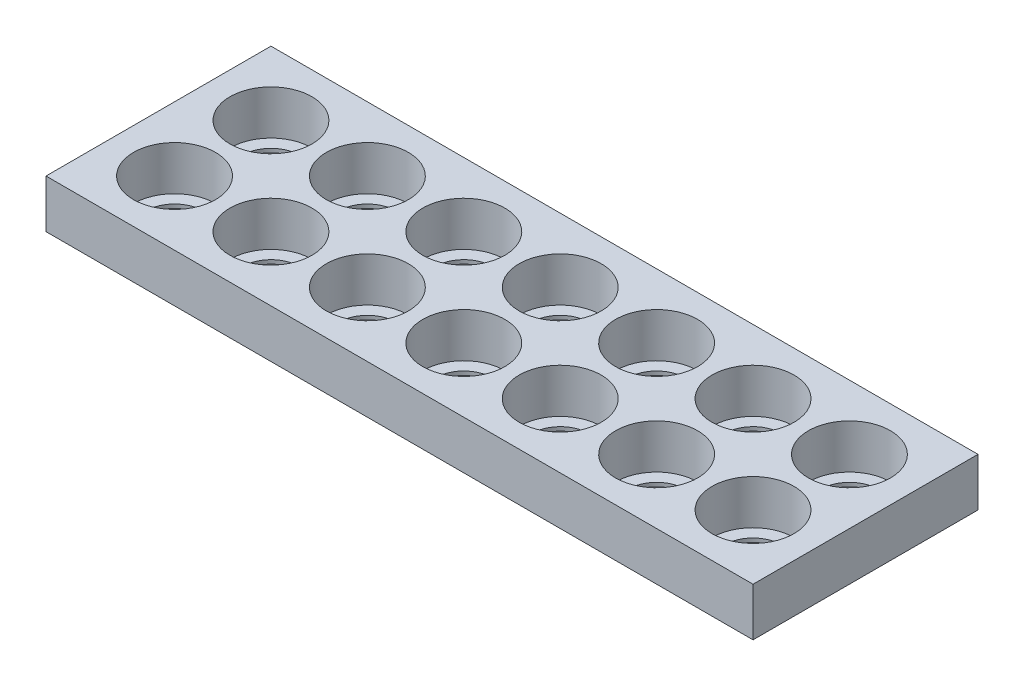
ISO-10303-21;
HEADER;
FILE_DESCRIPTION(('STEP AP214'),'2;1');
FILE_NAME('part.step','',(''),(''),'','','');
FILE_SCHEMA(('AUTOMOTIVE_DESIGN { 1 0 10303 214 1 1 1 1 }'));
ENDSEC;
DATA;
#1=APPLICATION_CONTEXT('core data for automotive mechanical design processes');
#2=APPLICATION_PROTOCOL_DEFINITION('international standard','automotive_design',2000,#1);
#3=PRODUCT_CONTEXT('',#1,'mechanical');
#4=PRODUCT('Part','Part','',(#3));
#5=PRODUCT_RELATED_PRODUCT_CATEGORY('part','',(#4));
#6=PRODUCT_DEFINITION_FORMATION('','',#4);
#7=PRODUCT_DEFINITION_CONTEXT('part definition',#1,'design');
#8=PRODUCT_DEFINITION('design','',#6,#7);
#9=PRODUCT_DEFINITION_SHAPE('','',#8);
#10=(LENGTH_UNIT() NAMED_UNIT(*) SI_UNIT(.MILLI.,.METRE.));
#11=(NAMED_UNIT(*) PLANE_ANGLE_UNIT() SI_UNIT($,.RADIAN.));
#12=(NAMED_UNIT(*) SI_UNIT($,.STERADIAN.) SOLID_ANGLE_UNIT());
#13=UNCERTAINTY_MEASURE_WITH_UNIT(LENGTH_MEASURE(1.E-05),#10,'distance_accuracy_value','');
#14=(GEOMETRIC_REPRESENTATION_CONTEXT(3) GLOBAL_UNCERTAINTY_ASSIGNED_CONTEXT((#13)) GLOBAL_UNIT_ASSIGNED_CONTEXT((#10,
#11,#12)) REPRESENTATION_CONTEXT('',''));
#15=CARTESIAN_POINT('',(0.,0.,0.));
#16=DIRECTION('',(0.,0.,1.));
#17=DIRECTION('',(1.,0.,0.));
#18=AXIS2_PLACEMENT_3D('',#15,#16,#17);
#19=CARTESIAN_POINT('',(0.,12.7,16.9333333333333));
#20=DIRECTION('',(0.,0.,-1.));
#21=DIRECTION('',(-1.,0.,0.));
#22=AXIS2_PLACEMENT_3D('',#19,#20,#21);
#23=PLANE('',#22);
#24=DIRECTION('',(1.,0.,0.));
#25=VECTOR('',#24,1.);
#26=CARTESIAN_POINT('',(0.,0.,16.9333333333333));
#27=LINE('',#26,#25);
#28=CARTESIAN_POINT('',(-16.9333333333333,0.,16.9333333333333));
#29=VERTEX_POINT('',#28);
#30=CARTESIAN_POINT('',(169.333333333333,0.,16.9333333333333));
#31=VERTEX_POINT('',#30);
#32=EDGE_CURVE('E120',#29,#31,#27,.T.);
#33=ORIENTED_EDGE('',*,*,#32,.T.);
#34=DIRECTION('',(0.,-1.,0.));
#35=VECTOR('',#34,1.);
#36=CARTESIAN_POINT('',(169.333333333333,12.7,16.9333333333333));
#37=LINE('',#36,#35);
#38=CARTESIAN_POINT('',(169.333333333333,12.7,16.9333333333333));
#39=VERTEX_POINT('',#38);
#40=EDGE_CURVE('E110',#39,#31,#37,.T.);
#41=ORIENTED_EDGE('',*,*,#40,.F.);
#42=DIRECTION('',(1.,0.,0.));
#43=VECTOR('',#42,1.);
#44=CARTESIAN_POINT('',(0.,12.7,16.9333333333333));
#45=LINE('',#44,#43);
#46=CARTESIAN_POINT('',(-16.9333333333333,12.7,16.9333333333333));
#47=VERTEX_POINT('',#46);
#48=EDGE_CURVE('E99',#47,#39,#45,.T.);
#49=ORIENTED_EDGE('',*,*,#48,.F.);
#50=DIRECTION('',(0.,-1.,0.));
#51=VECTOR('',#50,1.);
#52=CARTESIAN_POINT('',(-16.9333333333333,12.7,16.9333333333333));
#53=LINE('',#52,#51);
#54=EDGE_CURVE('E65',#47,#29,#53,.T.);
#55=ORIENTED_EDGE('',*,*,#54,.T.);
#56=EDGE_LOOP('',(#33,#41,#49,#55));
#57=FACE_BOUND('',#56,.T.);
#58=ADVANCED_FACE('F47',(#57),#23,.F.);
#59=CARTESIAN_POINT('',(169.333333333333,12.7,0.));
#60=DIRECTION('',(-1.,0.,0.));
#61=DIRECTION('',(0.,0.,1.));
#62=AXIS2_PLACEMENT_3D('',#59,#60,#61);
#63=PLANE('',#62);
#64=DIRECTION('',(0.,0.,-1.));
#65=VECTOR('',#64,1.);
#66=CARTESIAN_POINT('',(169.333333333333,0.,0.));
#67=LINE('',#66,#65);
#68=CARTESIAN_POINT('',(169.333333333333,0.,-42.3333333333333));
#69=VERTEX_POINT('',#68);
#70=EDGE_CURVE('E106',#31,#69,#67,.T.);
#71=ORIENTED_EDGE('',*,*,#70,.T.);
#72=DIRECTION('',(0.,-1.,0.));
#73=VECTOR('',#72,1.);
#74=CARTESIAN_POINT('',(169.333333333333,12.7,-42.3333333333333));
#75=LINE('',#74,#73);
#76=CARTESIAN_POINT('',(169.333333333333,12.7,-42.3333333333333));
#77=VERTEX_POINT('',#76);
#78=EDGE_CURVE('E104',#77,#69,#75,.T.);
#79=ORIENTED_EDGE('',*,*,#78,.F.);
#80=DIRECTION('',(0.,0.,-1.));
#81=VECTOR('',#80,1.);
#82=CARTESIAN_POINT('',(169.333333333333,12.7,0.));
#83=LINE('',#82,#81);
#84=EDGE_CURVE('E91',#39,#77,#83,.T.);
#85=ORIENTED_EDGE('',*,*,#84,.F.);
#86=ORIENTED_EDGE('',*,*,#40,.T.);
#87=EDGE_LOOP('',(#71,#79,#85,#86));
#88=FACE_BOUND('',#87,.T.);
#89=ADVANCED_FACE('F105',(#88),#63,.F.);
#90=CARTESIAN_POINT('',(0.,12.7,-42.3333333333333));
#91=DIRECTION('',(0.,0.,-1.));
#92=DIRECTION('',(-1.,0.,0.));
#93=AXIS2_PLACEMENT_3D('',#90,#91,#92);
#94=PLANE('',#93);
#95=DIRECTION('',(1.,0.,0.));
#96=VECTOR('',#95,1.);
#97=CARTESIAN_POINT('',(0.,0.,-42.3333333333333));
#98=LINE('',#97,#96);
#99=CARTESIAN_POINT('',(-16.9333333333333,0.,-42.3333333333333));
#100=VERTEX_POINT('',#99);
#101=EDGE_CURVE('E126',#100,#69,#98,.T.);
#102=ORIENTED_EDGE('',*,*,#101,.F.);
#103=DIRECTION('',(0.,-1.,0.));
#104=VECTOR('',#103,1.);
#105=CARTESIAN_POINT('',(-16.9333333333333,12.7,-42.3333333333333));
#106=LINE('',#105,#104);
#107=CARTESIAN_POINT('',(-16.9333333333333,12.7,-42.3333333333333));
#108=VERTEX_POINT('',#107);
#109=EDGE_CURVE('E79',#108,#100,#106,.T.);
#110=ORIENTED_EDGE('',*,*,#109,.F.);
#111=DIRECTION('',(1.,0.,0.));
#112=VECTOR('',#111,1.);
#113=CARTESIAN_POINT('',(0.,12.7,-42.3333333333333));
#114=LINE('',#113,#112);
#115=EDGE_CURVE('E98',#108,#77,#114,.T.);
#116=ORIENTED_EDGE('',*,*,#115,.T.);
#117=ORIENTED_EDGE('',*,*,#78,.T.);
#118=EDGE_LOOP('',(#102,#110,#116,#117));
#119=FACE_BOUND('',#118,.T.);
#120=ADVANCED_FACE('F112',(#119),#94,.T.);
#121=CARTESIAN_POINT('',(0.,12.7,0.));
#122=DIRECTION('',(0.,-1.,0.));
#123=DIRECTION('',(0.,0.,-1.));
#124=AXIS2_PLACEMENT_3D('',#121,#122,#123);
#125=CYLINDRICAL_SURFACE('',#124,10.8);
#126=CARTESIAN_POINT('',(0.,1.016,0.));
#127=DIRECTION('',(0.,1.,0.));
#128=DIRECTION('',(0.,0.,1.));
#129=AXIS2_PLACEMENT_3D('',#126,#127,#128);
#130=CIRCLE('',#129,10.8);
#131=CARTESIAN_POINT('',(0.,1.016,10.8));
#132=VERTEX_POINT('',#131);
#133=EDGE_CURVE('E168',#132,#132,#130,.T.);
#134=ORIENTED_EDGE('',*,*,#133,.F.);
#135=EDGE_LOOP('',(#134));
#136=FACE_BOUND('',#135,.T.);
#137=CARTESIAN_POINT('',(0.,12.7,0.));
#138=DIRECTION('',(0.,1.,0.));
#139=DIRECTION('',(0.,0.,1.));
#140=AXIS2_PLACEMENT_3D('',#137,#138,#139);
#141=CIRCLE('',#140,10.8);
#142=CARTESIAN_POINT('',(0.,12.7,10.8));
#143=VERTEX_POINT('',#142);
#144=EDGE_CURVE('E228',#143,#143,#141,.T.);
#145=ORIENTED_EDGE('',*,*,#144,.T.);
#146=EDGE_LOOP('',(#145));
#147=FACE_BOUND('',#146,.T.);
#148=ADVANCED_FACE('F234',(#136,#147),#125,.F.);
#149=CARTESIAN_POINT('',(25.4,12.7,0.));
#150=DIRECTION('',(0.,-1.,0.));
#151=DIRECTION('',(0.,0.,-1.));
#152=AXIS2_PLACEMENT_3D('',#149,#150,#151);
#153=CYLINDRICAL_SURFACE('',#152,10.8);
#154=CARTESIAN_POINT('',(25.4,1.016,0.));
#155=DIRECTION('',(0.,1.,0.));
#156=DIRECTION('',(0.,0.,1.));
#157=AXIS2_PLACEMENT_3D('',#154,#155,#156);
#158=CIRCLE('',#157,10.8);
#159=CARTESIAN_POINT('',(25.4,1.016,10.8));
#160=VERTEX_POINT('',#159);
#161=EDGE_CURVE('E172',#160,#160,#158,.T.);
#162=ORIENTED_EDGE('',*,*,#161,.F.);
#163=EDGE_LOOP('',(#162));
#164=FACE_BOUND('',#163,.T.);
#165=CARTESIAN_POINT('',(25.4,12.7,0.));
#166=DIRECTION('',(0.,1.,0.));
#167=DIRECTION('',(0.,0.,1.));
#168=AXIS2_PLACEMENT_3D('',#165,#166,#167);
#169=CIRCLE('',#168,10.8);
#170=CARTESIAN_POINT('',(25.4,12.7,10.8));
#171=VERTEX_POINT('',#170);
#172=EDGE_CURVE('E224',#171,#171,#169,.T.);
#173=ORIENTED_EDGE('',*,*,#172,.T.);
#174=EDGE_LOOP('',(#173));
#175=FACE_BOUND('',#174,.T.);
#176=ADVANCED_FACE('F262',(#164,#175),#153,.F.);
#177=CARTESIAN_POINT('',(50.8,12.7,0.));
#178=DIRECTION('',(0.,-1.,0.));
#179=DIRECTION('',(0.,0.,-1.));
#180=AXIS2_PLACEMENT_3D('',#177,#178,#179);
#181=CYLINDRICAL_SURFACE('',#180,10.8);
#182=CARTESIAN_POINT('',(50.8,1.016,0.));
#183=DIRECTION('',(0.,1.,0.));
#184=DIRECTION('',(0.,0.,1.));
#185=AXIS2_PLACEMENT_3D('',#182,#183,#184);
#186=CIRCLE('',#185,10.8);
#187=CARTESIAN_POINT('',(50.8,1.016,10.8));
#188=VERTEX_POINT('',#187);
#189=EDGE_CURVE('E176',#188,#188,#186,.T.);
#190=ORIENTED_EDGE('',*,*,#189,.F.);
#191=EDGE_LOOP('',(#190));
#192=FACE_BOUND('',#191,.T.);
#193=CARTESIAN_POINT('',(50.8,12.7,0.));
#194=DIRECTION('',(0.,1.,0.));
#195=DIRECTION('',(0.,0.,1.));
#196=AXIS2_PLACEMENT_3D('',#193,#194,#195);
#197=CIRCLE('',#196,10.8);
#198=CARTESIAN_POINT('',(50.8,12.7,10.8));
#199=VERTEX_POINT('',#198);
#200=EDGE_CURVE('E220',#199,#199,#197,.T.);
#201=ORIENTED_EDGE('',*,*,#200,.T.);
#202=EDGE_LOOP('',(#201));
#203=FACE_BOUND('',#202,.T.);
#204=ADVANCED_FACE('F266',(#192,#203),#181,.F.);
#205=CARTESIAN_POINT('',(76.2,12.7,0.));
#206=DIRECTION('',(0.,-1.,0.));
#207=DIRECTION('',(0.,0.,-1.));
#208=AXIS2_PLACEMENT_3D('',#205,#206,#207);
#209=CYLINDRICAL_SURFACE('',#208,10.8);
#210=CARTESIAN_POINT('',(76.2,1.016,0.));
#211=DIRECTION('',(0.,1.,0.));
#212=DIRECTION('',(0.,0.,1.));
#213=AXIS2_PLACEMENT_3D('',#210,#211,#212);
#214=CIRCLE('',#213,10.8);
#215=CARTESIAN_POINT('',(76.2,1.016,10.8));
#216=VERTEX_POINT('',#215);
#217=EDGE_CURVE('E180',#216,#216,#214,.T.);
#218=ORIENTED_EDGE('',*,*,#217,.F.);
#219=EDGE_LOOP('',(#218));
#220=FACE_BOUND('',#219,.T.);
#221=CARTESIAN_POINT('',(76.2,12.7,0.));
#222=DIRECTION('',(0.,1.,0.));
#223=DIRECTION('',(0.,0.,1.));
#224=AXIS2_PLACEMENT_3D('',#221,#222,#223);
#225=CIRCLE('',#224,10.8);
#226=CARTESIAN_POINT('',(76.2,12.7,10.8));
#227=VERTEX_POINT('',#226);
#228=EDGE_CURVE('E210',#227,#227,#225,.T.);
#229=ORIENTED_EDGE('',*,*,#228,.T.);
#230=EDGE_LOOP('',(#229));
#231=FACE_BOUND('',#230,.T.);
#232=ADVANCED_FACE('F270',(#220,#231),#209,.F.);
#233=CARTESIAN_POINT('',(101.6,12.7,0.));
#234=DIRECTION('',(0.,-1.,0.));
#235=DIRECTION('',(0.,0.,-1.));
#236=AXIS2_PLACEMENT_3D('',#233,#234,#235);
#237=CYLINDRICAL_SURFACE('',#236,10.8);
#238=CARTESIAN_POINT('',(101.6,1.016,0.));
#239=DIRECTION('',(0.,1.,0.));
#240=DIRECTION('',(0.,0.,1.));
#241=AXIS2_PLACEMENT_3D('',#238,#239,#240);
#242=CIRCLE('',#241,10.8);
#243=CARTESIAN_POINT('',(101.6,1.016,10.8));
#244=VERTEX_POINT('',#243);
#245=EDGE_CURVE('E184',#244,#244,#242,.T.);
#246=ORIENTED_EDGE('',*,*,#245,.F.);
#247=EDGE_LOOP('',(#246));
#248=FACE_BOUND('',#247,.T.);
#249=CARTESIAN_POINT('',(101.6,12.7,0.));
#250=DIRECTION('',(0.,1.,0.));
#251=DIRECTION('',(0.,0.,1.));
#252=AXIS2_PLACEMENT_3D('',#249,#250,#251);
#253=CIRCLE('',#252,10.8);
#254=CARTESIAN_POINT('',(101.6,12.7,10.8));
#255=VERTEX_POINT('',#254);
#256=EDGE_CURVE('E204',#255,#255,#253,.T.);
#257=ORIENTED_EDGE('',*,*,#256,.T.);
#258=EDGE_LOOP('',(#257));
#259=FACE_BOUND('',#258,.T.);
#260=ADVANCED_FACE('F197',(#248,#259),#237,.F.);
#261=CARTESIAN_POINT('',(127.,12.7,0.));
#262=DIRECTION('',(0.,-1.,0.));
#263=DIRECTION('',(0.,0.,-1.));
#264=AXIS2_PLACEMENT_3D('',#261,#262,#263);
#265=CYLINDRICAL_SURFACE('',#264,10.8);
#266=CARTESIAN_POINT('',(127.,1.016,0.));
#267=DIRECTION('',(0.,1.,0.));
#268=DIRECTION('',(0.,0.,1.));
#269=AXIS2_PLACEMENT_3D('',#266,#267,#268);
#270=CIRCLE('',#269,10.8);
#271=CARTESIAN_POINT('',(127.,1.016,10.8));
#272=VERTEX_POINT('',#271);
#273=EDGE_CURVE('E57',#272,#272,#270,.T.);
#274=ORIENTED_EDGE('',*,*,#273,.F.);
#275=EDGE_LOOP('',(#274));
#276=FACE_BOUND('',#275,.T.);
#277=CARTESIAN_POINT('',(127.,12.7,0.));
#278=DIRECTION('',(0.,1.,0.));
#279=DIRECTION('',(0.,0.,1.));
#280=AXIS2_PLACEMENT_3D('',#277,#278,#279);
#281=CIRCLE('',#280,10.8);
#282=CARTESIAN_POINT('',(127.,12.7,10.8));
#283=VERTEX_POINT('',#282);
#284=EDGE_CURVE('E201',#283,#283,#281,.T.);
#285=ORIENTED_EDGE('',*,*,#284,.T.);
#286=EDGE_LOOP('',(#285));
#287=FACE_BOUND('',#286,.T.);
#288=ADVANCED_FACE('F193',(#276,#287),#265,.F.);
#289=CARTESIAN_POINT('',(152.4,12.7,0.));
#290=DIRECTION('',(0.,-1.,0.));
#291=DIRECTION('',(0.,0.,-1.));
#292=AXIS2_PLACEMENT_3D('',#289,#290,#291);
#293=CYLINDRICAL_SURFACE('',#292,10.8);
#294=CARTESIAN_POINT('',(152.4,1.016,0.));
#295=DIRECTION('',(0.,1.,0.));
#296=DIRECTION('',(0.,0.,1.));
#297=AXIS2_PLACEMENT_3D('',#294,#295,#296);
#298=CIRCLE('',#297,10.8);
#299=CARTESIAN_POINT('',(152.4,1.016,10.8));
#300=VERTEX_POINT('',#299);
#301=EDGE_CURVE('E11',#300,#300,#298,.T.);
#302=ORIENTED_EDGE('',*,*,#301,.F.);
#303=EDGE_LOOP('',(#302));
#304=FACE_BOUND('',#303,.T.);
#305=CARTESIAN_POINT('',(152.4,12.7,0.));
#306=DIRECTION('',(0.,1.,0.));
#307=DIRECTION('',(0.,0.,1.));
#308=AXIS2_PLACEMENT_3D('',#305,#306,#307);
#309=CIRCLE('',#308,10.8);
#310=CARTESIAN_POINT('',(152.4,12.7,10.8));
#311=VERTEX_POINT('',#310);
#312=EDGE_CURVE('E205',#311,#311,#309,.T.);
#313=ORIENTED_EDGE('',*,*,#312,.T.);
#314=EDGE_LOOP('',(#313));
#315=FACE_BOUND('',#314,.T.);
#316=ADVANCED_FACE('F196',(#304,#315),#293,.F.);
#317=CARTESIAN_POINT('',(25.3999999999999,12.7,-25.4));
#318=DIRECTION('',(0.,-1.,0.));
#319=DIRECTION('',(0.,0.,-1.));
#320=AXIS2_PLACEMENT_3D('',#317,#318,#319);
#321=CYLINDRICAL_SURFACE('',#320,10.8);
#322=CARTESIAN_POINT('',(25.3999999999999,1.016,-25.4));
#323=DIRECTION('',(0.,1.,0.));
#324=DIRECTION('',(0.,0.,1.));
#325=AXIS2_PLACEMENT_3D('',#322,#323,#324);
#326=CIRCLE('',#325,10.8);
#327=CARTESIAN_POINT('',(25.3999999999999,1.016,-14.6));
#328=VERTEX_POINT('',#327);
#329=EDGE_CURVE('E144',#328,#328,#326,.T.);
#330=ORIENTED_EDGE('',*,*,#329,.F.);
#331=EDGE_LOOP('',(#330));
#332=FACE_BOUND('',#331,.T.);
#333=CARTESIAN_POINT('',(25.3999999999999,12.7,-25.4));
#334=DIRECTION('',(0.,1.,0.));
#335=DIRECTION('',(0.,0.,1.));
#336=AXIS2_PLACEMENT_3D('',#333,#334,#335);
#337=CIRCLE('',#336,10.8);
#338=CARTESIAN_POINT('',(25.3999999999999,12.7,-14.6));
#339=VERTEX_POINT('',#338);
#340=EDGE_CURVE('E213',#339,#339,#337,.T.);
#341=ORIENTED_EDGE('',*,*,#340,.T.);
#342=EDGE_LOOP('',(#341));
#343=FACE_BOUND('',#342,.T.);
#344=ADVANCED_FACE('F280',(#332,#343),#321,.F.);
#345=CARTESIAN_POINT('',(50.7999999999999,12.7,-25.4));
#346=DIRECTION('',(0.,-1.,0.));
#347=DIRECTION('',(0.,0.,-1.));
#348=AXIS2_PLACEMENT_3D('',#345,#346,#347);
#349=CYLINDRICAL_SURFACE('',#348,10.8);
#350=CARTESIAN_POINT('',(50.7999999999999,1.016,-25.4));
#351=DIRECTION('',(0.,1.,0.));
#352=DIRECTION('',(0.,0.,1.));
#353=AXIS2_PLACEMENT_3D('',#350,#351,#352);
#354=CIRCLE('',#353,10.8);
#355=CARTESIAN_POINT('',(50.7999999999999,1.016,-14.6));
#356=VERTEX_POINT('',#355);
#357=EDGE_CURVE('E148',#356,#356,#354,.T.);
#358=ORIENTED_EDGE('',*,*,#357,.F.);
#359=EDGE_LOOP('',(#358));
#360=FACE_BOUND('',#359,.T.);
#361=CARTESIAN_POINT('',(50.7999999999999,12.7,-25.4));
#362=DIRECTION('',(0.,1.,0.));
#363=DIRECTION('',(0.,0.,1.));
#364=AXIS2_PLACEMENT_3D('',#361,#362,#363);
#365=CIRCLE('',#364,10.8);
#366=CARTESIAN_POINT('',(50.7999999999999,12.7,-14.6));
#367=VERTEX_POINT('',#366);
#368=EDGE_CURVE('E331',#367,#367,#365,.T.);
#369=ORIENTED_EDGE('',*,*,#368,.T.);
#370=EDGE_LOOP('',(#369));
#371=FACE_BOUND('',#370,.T.);
#372=ADVANCED_FACE('F284',(#360,#371),#349,.F.);
#373=CARTESIAN_POINT('',(76.1999999999999,12.7,-25.4));
#374=DIRECTION('',(0.,-1.,0.));
#375=DIRECTION('',(0.,0.,-1.));
#376=AXIS2_PLACEMENT_3D('',#373,#374,#375);
#377=CYLINDRICAL_SURFACE('',#376,10.8);
#378=CARTESIAN_POINT('',(76.1999999999999,1.016,-25.4));
#379=DIRECTION('',(0.,1.,0.));
#380=DIRECTION('',(0.,0.,1.));
#381=AXIS2_PLACEMENT_3D('',#378,#379,#380);
#382=CIRCLE('',#381,10.8);
#383=CARTESIAN_POINT('',(76.1999999999999,1.016,-14.6));
#384=VERTEX_POINT('',#383);
#385=EDGE_CURVE('E152',#384,#384,#382,.T.);
#386=ORIENTED_EDGE('',*,*,#385,.F.);
#387=EDGE_LOOP('',(#386));
#388=FACE_BOUND('',#387,.T.);
#389=CARTESIAN_POINT('',(76.1999999999999,12.7,-25.4));
#390=DIRECTION('',(0.,1.,0.));
#391=DIRECTION('',(0.,0.,1.));
#392=AXIS2_PLACEMENT_3D('',#389,#390,#391);
#393=CIRCLE('',#392,10.8);
#394=CARTESIAN_POINT('',(76.1999999999999,12.7,-14.6));
#395=VERTEX_POINT('',#394);
#396=EDGE_CURVE('E327',#395,#395,#393,.T.);
#397=ORIENTED_EDGE('',*,*,#396,.T.);
#398=EDGE_LOOP('',(#397));
#399=FACE_BOUND('',#398,.T.);
#400=ADVANCED_FACE('F288',(#388,#399),#377,.F.);
#401=CARTESIAN_POINT('',(101.6,12.7,-25.4));
#402=DIRECTION('',(0.,-1.,0.));
#403=DIRECTION('',(0.,0.,-1.));
#404=AXIS2_PLACEMENT_3D('',#401,#402,#403);
#405=CYLINDRICAL_SURFACE('',#404,10.8);
#406=CARTESIAN_POINT('',(101.6,1.016,-25.4));
#407=DIRECTION('',(0.,1.,0.));
#408=DIRECTION('',(0.,0.,1.));
#409=AXIS2_PLACEMENT_3D('',#406,#407,#408);
#410=CIRCLE('',#409,10.8);
#411=CARTESIAN_POINT('',(101.6,1.016,-14.6));
#412=VERTEX_POINT('',#411);
#413=EDGE_CURVE('E156',#412,#412,#410,.T.);
#414=ORIENTED_EDGE('',*,*,#413,.F.);
#415=EDGE_LOOP('',(#414));
#416=FACE_BOUND('',#415,.T.);
#417=CARTESIAN_POINT('',(101.6,12.7,-25.4));
#418=DIRECTION('',(0.,1.,0.));
#419=DIRECTION('',(0.,0.,1.));
#420=AXIS2_PLACEMENT_3D('',#417,#418,#419);
#421=CIRCLE('',#420,10.8);
#422=CARTESIAN_POINT('',(101.6,12.7,-14.6));
#423=VERTEX_POINT('',#422);
#424=EDGE_CURVE('E318',#423,#423,#421,.T.);
#425=ORIENTED_EDGE('',*,*,#424,.T.);
#426=EDGE_LOOP('',(#425));
#427=FACE_BOUND('',#426,.T.);
#428=ADVANCED_FACE('F292',(#416,#427),#405,.F.);
#429=CARTESIAN_POINT('',(127.,12.7,-25.4));
#430=DIRECTION('',(0.,-1.,0.));
#431=DIRECTION('',(0.,0.,-1.));
#432=AXIS2_PLACEMENT_3D('',#429,#430,#431);
#433=CYLINDRICAL_SURFACE('',#432,10.8);
#434=CARTESIAN_POINT('',(127.,1.016,-25.4));
#435=DIRECTION('',(0.,1.,0.));
#436=DIRECTION('',(0.,0.,1.));
#437=AXIS2_PLACEMENT_3D('',#434,#435,#436);
#438=CIRCLE('',#437,10.8);
#439=CARTESIAN_POINT('',(127.,1.016,-14.6));
#440=VERTEX_POINT('',#439);
#441=EDGE_CURVE('E160',#440,#440,#438,.T.);
#442=ORIENTED_EDGE('',*,*,#441,.F.);
#443=EDGE_LOOP('',(#442));
#444=FACE_BOUND('',#443,.T.);
#445=CARTESIAN_POINT('',(127.,12.7,-25.4));
#446=DIRECTION('',(0.,1.,0.));
#447=DIRECTION('',(0.,0.,1.));
#448=AXIS2_PLACEMENT_3D('',#445,#446,#447);
#449=CIRCLE('',#448,10.8);
#450=CARTESIAN_POINT('',(127.,12.7,-14.6));
#451=VERTEX_POINT('',#450);
#452=EDGE_CURVE('E313',#451,#451,#449,.T.);
#453=ORIENTED_EDGE('',*,*,#452,.T.);
#454=EDGE_LOOP('',(#453));
#455=FACE_BOUND('',#454,.T.);
#456=ADVANCED_FACE('F296',(#444,#455),#433,.F.);
#457=CARTESIAN_POINT('',(152.4,12.7,-25.4));
#458=DIRECTION('',(0.,-1.,0.));
#459=DIRECTION('',(0.,0.,-1.));
#460=AXIS2_PLACEMENT_3D('',#457,#458,#459);
#461=CYLINDRICAL_SURFACE('',#460,10.8);
#462=CARTESIAN_POINT('',(152.4,1.016,-25.4));
#463=DIRECTION('',(0.,1.,0.));
#464=DIRECTION('',(0.,0.,1.));
#465=AXIS2_PLACEMENT_3D('',#462,#463,#464);
#466=CIRCLE('',#465,10.8);
#467=CARTESIAN_POINT('',(152.4,1.016,-14.6));
#468=VERTEX_POINT('',#467);
#469=EDGE_CURVE('E164',#468,#468,#466,.T.);
#470=ORIENTED_EDGE('',*,*,#469,.F.);
#471=EDGE_LOOP('',(#470));
#472=FACE_BOUND('',#471,.T.);
#473=CARTESIAN_POINT('',(152.4,12.7,-25.4));
#474=DIRECTION('',(0.,1.,0.));
#475=DIRECTION('',(0.,0.,1.));
#476=AXIS2_PLACEMENT_3D('',#473,#474,#475);
#477=CIRCLE('',#476,10.8);
#478=CARTESIAN_POINT('',(152.4,12.7,-14.6));
#479=VERTEX_POINT('',#478);
#480=EDGE_CURVE('E311',#479,#479,#477,.T.);
#481=ORIENTED_EDGE('',*,*,#480,.T.);
#482=EDGE_LOOP('',(#481));
#483=FACE_BOUND('',#482,.T.);
#484=ADVANCED_FACE('F299',(#472,#483),#461,.F.);
#485=CARTESIAN_POINT('',(0.,12.7,-25.4));
#486=DIRECTION('',(0.,-1.,0.));
#487=DIRECTION('',(0.,0.,-1.));
#488=AXIS2_PLACEMENT_3D('',#485,#486,#487);
#489=CYLINDRICAL_SURFACE('',#488,10.8);
#490=CARTESIAN_POINT('',(0.,1.016,-25.4));
#491=DIRECTION('',(0.,1.,0.));
#492=DIRECTION('',(0.,0.,1.));
#493=AXIS2_PLACEMENT_3D('',#490,#491,#492);
#494=CIRCLE('',#493,10.8);
#495=CARTESIAN_POINT('',(0.,1.016,-14.6));
#496=VERTEX_POINT('',#495);
#497=EDGE_CURVE('E140',#496,#496,#494,.T.);
#498=ORIENTED_EDGE('',*,*,#497,.F.);
#499=EDGE_LOOP('',(#498));
#500=FACE_BOUND('',#499,.T.);
#501=CARTESIAN_POINT('',(0.,12.7,-25.4));
#502=DIRECTION('',(0.,1.,0.));
#503=DIRECTION('',(0.,0.,1.));
#504=AXIS2_PLACEMENT_3D('',#501,#502,#503);
#505=CIRCLE('',#504,10.8);
#506=CARTESIAN_POINT('',(0.,12.7,-14.6));
#507=VERTEX_POINT('',#506);
#508=EDGE_CURVE('E133',#507,#507,#505,.T.);
#509=ORIENTED_EDGE('',*,*,#508,.T.);
#510=EDGE_LOOP('',(#509));
#511=FACE_BOUND('',#510,.T.);
#512=ADVANCED_FACE('F49',(#500,#511),#489,.F.);
#513=CARTESIAN_POINT('',(-16.9333333333333,12.7,0.));
#514=DIRECTION('',(-1.,0.,0.));
#515=DIRECTION('',(0.,0.,1.));
#516=AXIS2_PLACEMENT_3D('',#513,#514,#515);
#517=PLANE('',#516);
#518=DIRECTION('',(0.,0.,-1.));
#519=VECTOR('',#518,1.);
#520=CARTESIAN_POINT('',(-16.9333333333333,0.,0.));
#521=LINE('',#520,#519);
#522=EDGE_CURVE('E129',#29,#100,#521,.T.);
#523=ORIENTED_EDGE('',*,*,#522,.F.);
#524=ORIENTED_EDGE('',*,*,#54,.F.);
#525=DIRECTION('',(0.,0.,-1.));
#526=VECTOR('',#525,1.);
#527=CARTESIAN_POINT('',(-16.9333333333333,12.7,0.));
#528=LINE('',#527,#526);
#529=EDGE_CURVE('E114',#47,#108,#528,.T.);
#530=ORIENTED_EDGE('',*,*,#529,.T.);
#531=ORIENTED_EDGE('',*,*,#109,.T.);
#532=EDGE_LOOP('',(#523,#524,#530,#531));
#533=FACE_BOUND('',#532,.T.);
#534=ADVANCED_FACE('F238',(#533),#517,.T.);
#535=CARTESIAN_POINT('',(0.,12.7,0.));
#536=DIRECTION('',(0.,1.,0.));
#537=DIRECTION('',(0.,0.,1.));
#538=AXIS2_PLACEMENT_3D('',#535,#536,#537);
#539=PLANE('',#538);
#540=ORIENTED_EDGE('',*,*,#508,.F.);
#541=EDGE_LOOP('',(#540));
#542=FACE_BOUND('',#541,.T.);
#543=ORIENTED_EDGE('',*,*,#480,.F.);
#544=EDGE_LOOP('',(#543));
#545=FACE_BOUND('',#544,.T.);
#546=ORIENTED_EDGE('',*,*,#452,.F.);
#547=EDGE_LOOP('',(#546));
#548=FACE_BOUND('',#547,.T.);
#549=ORIENTED_EDGE('',*,*,#424,.F.);
#550=EDGE_LOOP('',(#549));
#551=FACE_BOUND('',#550,.T.);
#552=ORIENTED_EDGE('',*,*,#396,.F.);
#553=EDGE_LOOP('',(#552));
#554=FACE_BOUND('',#553,.T.);
#555=ORIENTED_EDGE('',*,*,#368,.F.);
#556=EDGE_LOOP('',(#555));
#557=FACE_BOUND('',#556,.T.);
#558=ORIENTED_EDGE('',*,*,#340,.F.);
#559=EDGE_LOOP('',(#558));
#560=FACE_BOUND('',#559,.T.);
#561=ORIENTED_EDGE('',*,*,#312,.F.);
#562=EDGE_LOOP('',(#561));
#563=FACE_BOUND('',#562,.T.);
#564=ORIENTED_EDGE('',*,*,#284,.F.);
#565=EDGE_LOOP('',(#564));
#566=FACE_BOUND('',#565,.T.);
#567=ORIENTED_EDGE('',*,*,#256,.F.);
#568=EDGE_LOOP('',(#567));
#569=FACE_BOUND('',#568,.T.);
#570=ORIENTED_EDGE('',*,*,#228,.F.);
#571=EDGE_LOOP('',(#570));
#572=FACE_BOUND('',#571,.T.);
#573=ORIENTED_EDGE('',*,*,#200,.F.);
#574=EDGE_LOOP('',(#573));
#575=FACE_BOUND('',#574,.T.);
#576=ORIENTED_EDGE('',*,*,#172,.F.);
#577=EDGE_LOOP('',(#576));
#578=FACE_BOUND('',#577,.T.);
#579=ORIENTED_EDGE('',*,*,#144,.F.);
#580=EDGE_LOOP('',(#579));
#581=FACE_BOUND('',#580,.T.);
#582=ORIENTED_EDGE('',*,*,#48,.T.);
#583=ORIENTED_EDGE('',*,*,#84,.T.);
#584=ORIENTED_EDGE('',*,*,#115,.F.);
#585=ORIENTED_EDGE('',*,*,#529,.F.);
#586=EDGE_LOOP('',(#582,#583,#584,#585));
#587=FACE_BOUND('',#586,.T.);
#588=ADVANCED_FACE('F95',(#542,#545,#548,#551,#554,#557,#560,#563,#566,#569,#572,#575,#578,#581,
#587),#539,.T.);
#589=CARTESIAN_POINT('',(0.,0.,0.));
#590=DIRECTION('',(0.,1.,0.));
#591=DIRECTION('',(0.,0.,1.));
#592=AXIS2_PLACEMENT_3D('',#589,#590,#591);
#593=PLANE('',#592);
#594=ORIENTED_EDGE('',*,*,#32,.F.);
#595=ORIENTED_EDGE('',*,*,#522,.T.);
#596=ORIENTED_EDGE('',*,*,#101,.T.);
#597=ORIENTED_EDGE('',*,*,#70,.F.);
#598=EDGE_LOOP('',(#594,#595,#596,#597));
#599=FACE_BOUND('',#598,.T.);
#600=CARTESIAN_POINT('',(0.,0.,-25.4));
#601=DIRECTION('',(0.,1.,0.));
#602=DIRECTION('',(0.,0.,1.));
#603=AXIS2_PLACEMENT_3D('',#600,#601,#602);
#604=CIRCLE('',#603,7.5);
#605=CARTESIAN_POINT('',(0.,0.,-17.9));
#606=VERTEX_POINT('',#605);
#607=EDGE_CURVE('E363',#606,#606,#604,.T.);
#608=ORIENTED_EDGE('',*,*,#607,.T.);
#609=EDGE_LOOP('',(#608));
#610=FACE_BOUND('',#609,.T.);
#611=CARTESIAN_POINT('',(25.3999999999999,0.,-25.4));
#612=DIRECTION('',(0.,1.,0.));
#613=DIRECTION('',(0.,0.,1.));
#614=AXIS2_PLACEMENT_3D('',#611,#612,#613);
#615=CIRCLE('',#614,7.5);
#616=CARTESIAN_POINT('',(25.3999999999999,0.,-17.9));
#617=VERTEX_POINT('',#616);
#618=EDGE_CURVE('E371',#617,#617,#615,.T.);
#619=ORIENTED_EDGE('',*,*,#618,.T.);
#620=EDGE_LOOP('',(#619));
#621=FACE_BOUND('',#620,.T.);
#622=CARTESIAN_POINT('',(50.7999999999999,0.,-25.4));
#623=DIRECTION('',(0.,1.,0.));
#624=DIRECTION('',(0.,0.,1.));
#625=AXIS2_PLACEMENT_3D('',#622,#623,#624);
#626=CIRCLE('',#625,7.5);
#627=CARTESIAN_POINT('',(50.7999999999999,0.,-17.9));
#628=VERTEX_POINT('',#627);
#629=EDGE_CURVE('E379',#628,#628,#626,.T.);
#630=ORIENTED_EDGE('',*,*,#629,.T.);
#631=EDGE_LOOP('',(#630));
#632=FACE_BOUND('',#631,.T.);
#633=CARTESIAN_POINT('',(76.1999999999999,0.,-25.4));
#634=DIRECTION('',(0.,1.,0.));
#635=DIRECTION('',(0.,0.,1.));
#636=AXIS2_PLACEMENT_3D('',#633,#634,#635);
#637=CIRCLE('',#636,7.5);
#638=CARTESIAN_POINT('',(76.1999999999999,0.,-17.9));
#639=VERTEX_POINT('',#638);
#640=EDGE_CURVE('E387',#639,#639,#637,.T.);
#641=ORIENTED_EDGE('',*,*,#640,.T.);
#642=EDGE_LOOP('',(#641));
#643=FACE_BOUND('',#642,.T.);
#644=CARTESIAN_POINT('',(101.6,0.,-25.4));
#645=DIRECTION('',(0.,1.,0.));
#646=DIRECTION('',(0.,0.,1.));
#647=AXIS2_PLACEMENT_3D('',#644,#645,#646);
#648=CIRCLE('',#647,7.5);
#649=CARTESIAN_POINT('',(101.6,0.,-17.9));
#650=VERTEX_POINT('',#649);
#651=EDGE_CURVE('E395',#650,#650,#648,.T.);
#652=ORIENTED_EDGE('',*,*,#651,.T.);
#653=EDGE_LOOP('',(#652));
#654=FACE_BOUND('',#653,.T.);
#655=CARTESIAN_POINT('',(127.,0.,-25.4));
#656=DIRECTION('',(0.,1.,0.));
#657=DIRECTION('',(0.,0.,1.));
#658=AXIS2_PLACEMENT_3D('',#655,#656,#657);
#659=CIRCLE('',#658,7.50000000000001);
#660=CARTESIAN_POINT('',(127.,0.,-17.9));
#661=VERTEX_POINT('',#660);
#662=EDGE_CURVE('E403',#661,#661,#659,.T.);
#663=ORIENTED_EDGE('',*,*,#662,.T.);
#664=EDGE_LOOP('',(#663));
#665=FACE_BOUND('',#664,.T.);
#666=CARTESIAN_POINT('',(152.4,0.,-25.4));
#667=DIRECTION('',(0.,1.,0.));
#668=DIRECTION('',(0.,0.,1.));
#669=AXIS2_PLACEMENT_3D('',#666,#667,#668);
#670=CIRCLE('',#669,7.50000000000001);
#671=CARTESIAN_POINT('',(152.4,0.,-17.9));
#672=VERTEX_POINT('',#671);
#673=EDGE_CURVE('E411',#672,#672,#670,.T.);
#674=ORIENTED_EDGE('',*,*,#673,.T.);
#675=EDGE_LOOP('',(#674));
#676=FACE_BOUND('',#675,.T.);
#677=CARTESIAN_POINT('',(0.,0.,0.));
#678=DIRECTION('',(0.,1.,0.));
#679=DIRECTION('',(0.,0.,1.));
#680=AXIS2_PLACEMENT_3D('',#677,#678,#679);
#681=CIRCLE('',#680,7.5);
#682=CARTESIAN_POINT('',(0.,0.,7.5));
#683=VERTEX_POINT('',#682);
#684=EDGE_CURVE('E419',#683,#683,#681,.T.);
#685=ORIENTED_EDGE('',*,*,#684,.T.);
#686=EDGE_LOOP('',(#685));
#687=FACE_BOUND('',#686,.T.);
#688=CARTESIAN_POINT('',(25.4,0.,0.));
#689=DIRECTION('',(0.,1.,0.));
#690=DIRECTION('',(0.,0.,1.));
#691=AXIS2_PLACEMENT_3D('',#688,#689,#690);
#692=CIRCLE('',#691,7.5);
#693=CARTESIAN_POINT('',(25.4,0.,7.5));
#694=VERTEX_POINT('',#693);
#695=EDGE_CURVE('E427',#694,#694,#692,.T.);
#696=ORIENTED_EDGE('',*,*,#695,.T.);
#697=EDGE_LOOP('',(#696));
#698=FACE_BOUND('',#697,.T.);
#699=CARTESIAN_POINT('',(50.8,0.,0.));
#700=DIRECTION('',(0.,1.,0.));
#701=DIRECTION('',(0.,0.,1.));
#702=AXIS2_PLACEMENT_3D('',#699,#700,#701);
#703=CIRCLE('',#702,7.5);
#704=CARTESIAN_POINT('',(50.8,0.,7.5));
#705=VERTEX_POINT('',#704);
#706=EDGE_CURVE('E435',#705,#705,#703,.T.);
#707=ORIENTED_EDGE('',*,*,#706,.T.);
#708=EDGE_LOOP('',(#707));
#709=FACE_BOUND('',#708,.T.);
#710=CARTESIAN_POINT('',(76.2,0.,0.));
#711=DIRECTION('',(0.,1.,0.));
#712=DIRECTION('',(0.,0.,1.));
#713=AXIS2_PLACEMENT_3D('',#710,#711,#712);
#714=CIRCLE('',#713,7.5);
#715=CARTESIAN_POINT('',(76.2,0.,7.5));
#716=VERTEX_POINT('',#715);
#717=EDGE_CURVE('E443',#716,#716,#714,.T.);
#718=ORIENTED_EDGE('',*,*,#717,.T.);
#719=EDGE_LOOP('',(#718));
#720=FACE_BOUND('',#719,.T.);
#721=CARTESIAN_POINT('',(101.6,0.,0.));
#722=DIRECTION('',(0.,1.,0.));
#723=DIRECTION('',(0.,0.,1.));
#724=AXIS2_PLACEMENT_3D('',#721,#722,#723);
#725=CIRCLE('',#724,7.5);
#726=CARTESIAN_POINT('',(101.6,0.,7.5));
#727=VERTEX_POINT('',#726);
#728=EDGE_CURVE('E451',#727,#727,#725,.T.);
#729=ORIENTED_EDGE('',*,*,#728,.T.);
#730=EDGE_LOOP('',(#729));
#731=FACE_BOUND('',#730,.T.);
#732=CARTESIAN_POINT('',(127.,0.,0.));
#733=DIRECTION('',(0.,1.,0.));
#734=DIRECTION('',(0.,0.,1.));
#735=AXIS2_PLACEMENT_3D('',#732,#733,#734);
#736=CIRCLE('',#735,7.50000000000001);
#737=CARTESIAN_POINT('',(127.,0.,7.50000000000001));
#738=VERTEX_POINT('',#737);
#739=EDGE_CURVE('E459',#738,#738,#736,.T.);
#740=ORIENTED_EDGE('',*,*,#739,.T.);
#741=EDGE_LOOP('',(#740));
#742=FACE_BOUND('',#741,.T.);
#743=CARTESIAN_POINT('',(152.4,0.,0.));
#744=DIRECTION('',(0.,1.,0.));
#745=DIRECTION('',(0.,0.,1.));
#746=AXIS2_PLACEMENT_3D('',#743,#744,#745);
#747=CIRCLE('',#746,7.50000000000001);
#748=CARTESIAN_POINT('',(152.4,0.,7.50000000000001));
#749=VERTEX_POINT('',#748);
#750=EDGE_CURVE('E467',#749,#749,#747,.T.);
#751=ORIENTED_EDGE('',*,*,#750,.T.);
#752=EDGE_LOOP('',(#751));
#753=FACE_BOUND('',#752,.T.);
#754=ADVANCED_FACE('F237',(#599,#610,#621,#632,#643,#654,#665,#676,#687,#698,#709,#720,#731,
#742,#753),#593,.F.);
#755=CARTESIAN_POINT('',(0.,1.016,-25.4));
#756=DIRECTION('',(0.,-1.,0.));
#757=DIRECTION('',(0.,0.,-1.));
#758=AXIS2_PLACEMENT_3D('',#755,#756,#757);
#759=CYLINDRICAL_SURFACE('',#758,7.5);
#760=CARTESIAN_POINT('',(0.,1.016,-25.4));
#761=DIRECTION('',(0.,1.,0.));
#762=DIRECTION('',(0.,0.,1.));
#763=AXIS2_PLACEMENT_3D('',#760,#761,#762);
#764=CIRCLE('',#763,7.5);
#765=CARTESIAN_POINT('',(0.,1.016,-17.9));
#766=VERTEX_POINT('',#765);
#767=EDGE_CURVE('E123',#766,#766,#764,.T.);
#768=ORIENTED_EDGE('',*,*,#767,.T.);
#769=EDGE_LOOP('',(#768));
#770=FACE_BOUND('',#769,.T.);
#771=ORIENTED_EDGE('',*,*,#607,.F.);
#772=EDGE_LOOP('',(#771));
#773=FACE_BOUND('',#772,.T.);
#774=ADVANCED_FACE('F246',(#770,#773),#759,.F.);
#775=CARTESIAN_POINT('',(0.,1.016,0.));
#776=DIRECTION('',(0.,1.,0.));
#777=DIRECTION('',(0.,0.,1.));
#778=AXIS2_PLACEMENT_3D('',#775,#776,#777);
#779=PLANE('',#778);
#780=ORIENTED_EDGE('',*,*,#767,.F.);
#781=EDGE_LOOP('',(#780));
#782=FACE_BOUND('',#781,.T.);
#783=ORIENTED_EDGE('',*,*,#497,.T.);
#784=EDGE_LOOP('',(#783));
#785=FACE_BOUND('',#784,.T.);
#786=ADVANCED_FACE('F582',(#782,#785),#779,.T.);
#787=CARTESIAN_POINT('',(25.3999999999999,1.016,-25.4));
#788=DIRECTION('',(0.,-1.,0.));
#789=DIRECTION('',(0.,0.,-1.));
#790=AXIS2_PLACEMENT_3D('',#787,#788,#789);
#791=CYLINDRICAL_SURFACE('',#790,7.5);
#792=CARTESIAN_POINT('',(25.3999999999999,1.016,-25.4));
#793=DIRECTION('',(0.,1.,0.));
#794=DIRECTION('',(0.,0.,1.));
#795=AXIS2_PLACEMENT_3D('',#792,#793,#794);
#796=CIRCLE('',#795,7.5);
#797=CARTESIAN_POINT('',(25.3999999999999,1.016,-17.9));
#798=VERTEX_POINT('',#797);
#799=EDGE_CURVE('E367',#798,#798,#796,.T.);
#800=ORIENTED_EDGE('',*,*,#799,.T.);
#801=EDGE_LOOP('',(#800));
#802=FACE_BOUND('',#801,.T.);
#803=ORIENTED_EDGE('',*,*,#618,.F.);
#804=EDGE_LOOP('',(#803));
#805=FACE_BOUND('',#804,.T.);
#806=ADVANCED_FACE('F578',(#802,#805),#791,.F.);
#807=CARTESIAN_POINT('',(0.,1.016,0.));
#808=DIRECTION('',(0.,1.,0.));
#809=DIRECTION('',(0.,0.,1.));
#810=AXIS2_PLACEMENT_3D('',#807,#808,#809);
#811=PLANE('',#810);
#812=ORIENTED_EDGE('',*,*,#799,.F.);
#813=EDGE_LOOP('',(#812));
#814=FACE_BOUND('',#813,.T.);
#815=ORIENTED_EDGE('',*,*,#329,.T.);
#816=EDGE_LOOP('',(#815));
#817=FACE_BOUND('',#816,.T.);
#818=ADVANCED_FACE('F574',(#814,#817),#811,.T.);
#819=CARTESIAN_POINT('',(50.7999999999999,1.016,-25.4));
#820=DIRECTION('',(0.,-1.,0.));
#821=DIRECTION('',(0.,0.,-1.));
#822=AXIS2_PLACEMENT_3D('',#819,#820,#821);
#823=CYLINDRICAL_SURFACE('',#822,7.5);
#824=CARTESIAN_POINT('',(50.7999999999999,1.016,-25.4));
#825=DIRECTION('',(0.,1.,0.));
#826=DIRECTION('',(0.,0.,1.));
#827=AXIS2_PLACEMENT_3D('',#824,#825,#826);
#828=CIRCLE('',#827,7.5);
#829=CARTESIAN_POINT('',(50.7999999999999,1.016,-17.9));
#830=VERTEX_POINT('',#829);
#831=EDGE_CURVE('E375',#830,#830,#828,.T.);
#832=ORIENTED_EDGE('',*,*,#831,.T.);
#833=EDGE_LOOP('',(#832));
#834=FACE_BOUND('',#833,.T.);
#835=ORIENTED_EDGE('',*,*,#629,.F.);
#836=EDGE_LOOP('',(#835));
#837=FACE_BOUND('',#836,.T.);
#838=ADVANCED_FACE('F570',(#834,#837),#823,.F.);
#839=CARTESIAN_POINT('',(0.,1.016,0.));
#840=DIRECTION('',(0.,1.,0.));
#841=DIRECTION('',(0.,0.,1.));
#842=AXIS2_PLACEMENT_3D('',#839,#840,#841);
#843=PLANE('',#842);
#844=ORIENTED_EDGE('',*,*,#831,.F.);
#845=EDGE_LOOP('',(#844));
#846=FACE_BOUND('',#845,.T.);
#847=ORIENTED_EDGE('',*,*,#357,.T.);
#848=EDGE_LOOP('',(#847));
#849=FACE_BOUND('',#848,.T.);
#850=ADVANCED_FACE('F566',(#846,#849),#843,.T.);
#851=CARTESIAN_POINT('',(76.1999999999999,1.016,-25.4));
#852=DIRECTION('',(0.,-1.,0.));
#853=DIRECTION('',(0.,0.,-1.));
#854=AXIS2_PLACEMENT_3D('',#851,#852,#853);
#855=CYLINDRICAL_SURFACE('',#854,7.5);
#856=CARTESIAN_POINT('',(76.1999999999999,1.016,-25.4));
#857=DIRECTION('',(0.,1.,0.));
#858=DIRECTION('',(0.,0.,1.));
#859=AXIS2_PLACEMENT_3D('',#856,#857,#858);
#860=CIRCLE('',#859,7.5);
#861=CARTESIAN_POINT('',(76.1999999999999,1.016,-17.9));
#862=VERTEX_POINT('',#861);
#863=EDGE_CURVE('E383',#862,#862,#860,.T.);
#864=ORIENTED_EDGE('',*,*,#863,.T.);
#865=EDGE_LOOP('',(#864));
#866=FACE_BOUND('',#865,.T.);
#867=ORIENTED_EDGE('',*,*,#640,.F.);
#868=EDGE_LOOP('',(#867));
#869=FACE_BOUND('',#868,.T.);
#870=ADVANCED_FACE('F562',(#866,#869),#855,.F.);
#871=CARTESIAN_POINT('',(0.,1.016,0.));
#872=DIRECTION('',(0.,1.,0.));
#873=DIRECTION('',(0.,0.,1.));
#874=AXIS2_PLACEMENT_3D('',#871,#872,#873);
#875=PLANE('',#874);
#876=ORIENTED_EDGE('',*,*,#863,.F.);
#877=EDGE_LOOP('',(#876));
#878=FACE_BOUND('',#877,.T.);
#879=ORIENTED_EDGE('',*,*,#385,.T.);
#880=EDGE_LOOP('',(#879));
#881=FACE_BOUND('',#880,.T.);
#882=ADVANCED_FACE('F558',(#878,#881),#875,.T.);
#883=CARTESIAN_POINT('',(101.6,1.016,-25.4));
#884=DIRECTION('',(0.,-1.,0.));
#885=DIRECTION('',(0.,0.,-1.));
#886=AXIS2_PLACEMENT_3D('',#883,#884,#885);
#887=CYLINDRICAL_SURFACE('',#886,7.5);
#888=CARTESIAN_POINT('',(101.6,1.016,-25.4));
#889=DIRECTION('',(0.,1.,0.));
#890=DIRECTION('',(0.,0.,1.));
#891=AXIS2_PLACEMENT_3D('',#888,#889,#890);
#892=CIRCLE('',#891,7.5);
#893=CARTESIAN_POINT('',(101.6,1.016,-17.9));
#894=VERTEX_POINT('',#893);
#895=EDGE_CURVE('E391',#894,#894,#892,.T.);
#896=ORIENTED_EDGE('',*,*,#895,.T.);
#897=EDGE_LOOP('',(#896));
#898=FACE_BOUND('',#897,.T.);
#899=ORIENTED_EDGE('',*,*,#651,.F.);
#900=EDGE_LOOP('',(#899));
#901=FACE_BOUND('',#900,.T.);
#902=ADVANCED_FACE('F554',(#898,#901),#887,.F.);
#903=CARTESIAN_POINT('',(0.,1.016,0.));
#904=DIRECTION('',(0.,1.,0.));
#905=DIRECTION('',(0.,0.,1.));
#906=AXIS2_PLACEMENT_3D('',#903,#904,#905);
#907=PLANE('',#906);
#908=ORIENTED_EDGE('',*,*,#895,.F.);
#909=EDGE_LOOP('',(#908));
#910=FACE_BOUND('',#909,.T.);
#911=ORIENTED_EDGE('',*,*,#413,.T.);
#912=EDGE_LOOP('',(#911));
#913=FACE_BOUND('',#912,.T.);
#914=ADVANCED_FACE('F550',(#910,#913),#907,.T.);
#915=CARTESIAN_POINT('',(127.,1.016,-25.4));
#916=DIRECTION('',(0.,-1.,0.));
#917=DIRECTION('',(0.,0.,-1.));
#918=AXIS2_PLACEMENT_3D('',#915,#916,#917);
#919=CYLINDRICAL_SURFACE('',#918,7.50000000000001);
#920=CARTESIAN_POINT('',(127.,1.016,-25.4));
#921=DIRECTION('',(0.,1.,0.));
#922=DIRECTION('',(0.,0.,1.));
#923=AXIS2_PLACEMENT_3D('',#920,#921,#922);
#924=CIRCLE('',#923,7.50000000000001);
#925=CARTESIAN_POINT('',(127.,1.016,-17.9));
#926=VERTEX_POINT('',#925);
#927=EDGE_CURVE('E399',#926,#926,#924,.T.);
#928=ORIENTED_EDGE('',*,*,#927,.T.);
#929=EDGE_LOOP('',(#928));
#930=FACE_BOUND('',#929,.T.);
#931=ORIENTED_EDGE('',*,*,#662,.F.);
#932=EDGE_LOOP('',(#931));
#933=FACE_BOUND('',#932,.T.);
#934=ADVANCED_FACE('F546',(#930,#933),#919,.F.);
#935=CARTESIAN_POINT('',(0.,1.016,0.));
#936=DIRECTION('',(0.,1.,0.));
#937=DIRECTION('',(0.,0.,1.));
#938=AXIS2_PLACEMENT_3D('',#935,#936,#937);
#939=PLANE('',#938);
#940=ORIENTED_EDGE('',*,*,#927,.F.);
#941=EDGE_LOOP('',(#940));
#942=FACE_BOUND('',#941,.T.);
#943=ORIENTED_EDGE('',*,*,#441,.T.);
#944=EDGE_LOOP('',(#943));
#945=FACE_BOUND('',#944,.T.);
#946=ADVANCED_FACE('F542',(#942,#945),#939,.T.);
#947=CARTESIAN_POINT('',(152.4,1.016,-25.4));
#948=DIRECTION('',(0.,-1.,0.));
#949=DIRECTION('',(0.,0.,-1.));
#950=AXIS2_PLACEMENT_3D('',#947,#948,#949);
#951=CYLINDRICAL_SURFACE('',#950,7.50000000000001);
#952=CARTESIAN_POINT('',(152.4,1.016,-25.4));
#953=DIRECTION('',(0.,1.,0.));
#954=DIRECTION('',(0.,0.,1.));
#955=AXIS2_PLACEMENT_3D('',#952,#953,#954);
#956=CIRCLE('',#955,7.50000000000001);
#957=CARTESIAN_POINT('',(152.4,1.016,-17.9));
#958=VERTEX_POINT('',#957);
#959=EDGE_CURVE('E407',#958,#958,#956,.T.);
#960=ORIENTED_EDGE('',*,*,#959,.T.);
#961=EDGE_LOOP('',(#960));
#962=FACE_BOUND('',#961,.T.);
#963=ORIENTED_EDGE('',*,*,#673,.F.);
#964=EDGE_LOOP('',(#963));
#965=FACE_BOUND('',#964,.T.);
#966=ADVANCED_FACE('F538',(#962,#965),#951,.F.);
#967=CARTESIAN_POINT('',(0.,1.016,0.));
#968=DIRECTION('',(0.,1.,0.));
#969=DIRECTION('',(0.,0.,1.));
#970=AXIS2_PLACEMENT_3D('',#967,#968,#969);
#971=PLANE('',#970);
#972=ORIENTED_EDGE('',*,*,#959,.F.);
#973=EDGE_LOOP('',(#972));
#974=FACE_BOUND('',#973,.T.);
#975=ORIENTED_EDGE('',*,*,#469,.T.);
#976=EDGE_LOOP('',(#975));
#977=FACE_BOUND('',#976,.T.);
#978=ADVANCED_FACE('F534',(#974,#977),#971,.T.);
#979=CARTESIAN_POINT('',(0.,1.016,0.));
#980=DIRECTION('',(0.,-1.,0.));
#981=DIRECTION('',(0.,0.,-1.));
#982=AXIS2_PLACEMENT_3D('',#979,#980,#981);
#983=CYLINDRICAL_SURFACE('',#982,7.5);
#984=CARTESIAN_POINT('',(0.,1.016,0.));
#985=DIRECTION('',(0.,1.,0.));
#986=DIRECTION('',(0.,0.,1.));
#987=AXIS2_PLACEMENT_3D('',#984,#985,#986);
#988=CIRCLE('',#987,7.5);
#989=CARTESIAN_POINT('',(0.,1.016,7.5));
#990=VERTEX_POINT('',#989);
#991=EDGE_CURVE('E415',#990,#990,#988,.T.);
#992=ORIENTED_EDGE('',*,*,#991,.T.);
#993=EDGE_LOOP('',(#992));
#994=FACE_BOUND('',#993,.T.);
#995=ORIENTED_EDGE('',*,*,#684,.F.);
#996=EDGE_LOOP('',(#995));
#997=FACE_BOUND('',#996,.T.);
#998=ADVANCED_FACE('F530',(#994,#997),#983,.F.);
#999=CARTESIAN_POINT('',(0.,1.016,0.));
#1000=DIRECTION('',(0.,1.,0.));
#1001=DIRECTION('',(0.,0.,1.));
#1002=AXIS2_PLACEMENT_3D('',#999,#1000,#1001);
#1003=PLANE('',#1002);
#1004=ORIENTED_EDGE('',*,*,#991,.F.);
#1005=EDGE_LOOP('',(#1004));
#1006=FACE_BOUND('',#1005,.T.);
#1007=ORIENTED_EDGE('',*,*,#133,.T.);
#1008=EDGE_LOOP('',(#1007));
#1009=FACE_BOUND('',#1008,.T.);
#1010=ADVANCED_FACE('F526',(#1006,#1009),#1003,.T.);
#1011=CARTESIAN_POINT('',(25.4,1.016,0.));
#1012=DIRECTION('',(0.,-1.,0.));
#1013=DIRECTION('',(0.,0.,-1.));
#1014=AXIS2_PLACEMENT_3D('',#1011,#1012,#1013);
#1015=CYLINDRICAL_SURFACE('',#1014,7.5);
#1016=CARTESIAN_POINT('',(25.4,1.016,0.));
#1017=DIRECTION('',(0.,1.,0.));
#1018=DIRECTION('',(0.,0.,1.));
#1019=AXIS2_PLACEMENT_3D('',#1016,#1017,#1018);
#1020=CIRCLE('',#1019,7.5);
#1021=CARTESIAN_POINT('',(25.4,1.016,7.5));
#1022=VERTEX_POINT('',#1021);
#1023=EDGE_CURVE('E423',#1022,#1022,#1020,.T.);
#1024=ORIENTED_EDGE('',*,*,#1023,.T.);
#1025=EDGE_LOOP('',(#1024));
#1026=FACE_BOUND('',#1025,.T.);
#1027=ORIENTED_EDGE('',*,*,#695,.F.);
#1028=EDGE_LOOP('',(#1027));
#1029=FACE_BOUND('',#1028,.T.);
#1030=ADVANCED_FACE('F522',(#1026,#1029),#1015,.F.);
#1031=CARTESIAN_POINT('',(0.,1.016,0.));
#1032=DIRECTION('',(0.,1.,0.));
#1033=DIRECTION('',(0.,0.,1.));
#1034=AXIS2_PLACEMENT_3D('',#1031,#1032,#1033);
#1035=PLANE('',#1034);
#1036=ORIENTED_EDGE('',*,*,#1023,.F.);
#1037=EDGE_LOOP('',(#1036));
#1038=FACE_BOUND('',#1037,.T.);
#1039=ORIENTED_EDGE('',*,*,#161,.T.);
#1040=EDGE_LOOP('',(#1039));
#1041=FACE_BOUND('',#1040,.T.);
#1042=ADVANCED_FACE('F518',(#1038,#1041),#1035,.T.);
#1043=CARTESIAN_POINT('',(50.8,1.016,0.));
#1044=DIRECTION('',(0.,-1.,0.));
#1045=DIRECTION('',(0.,0.,-1.));
#1046=AXIS2_PLACEMENT_3D('',#1043,#1044,#1045);
#1047=CYLINDRICAL_SURFACE('',#1046,7.5);
#1048=CARTESIAN_POINT('',(50.8,1.016,0.));
#1049=DIRECTION('',(0.,1.,0.));
#1050=DIRECTION('',(0.,0.,1.));
#1051=AXIS2_PLACEMENT_3D('',#1048,#1049,#1050);
#1052=CIRCLE('',#1051,7.5);
#1053=CARTESIAN_POINT('',(50.8,1.016,7.5));
#1054=VERTEX_POINT('',#1053);
#1055=EDGE_CURVE('E431',#1054,#1054,#1052,.T.);
#1056=ORIENTED_EDGE('',*,*,#1055,.T.);
#1057=EDGE_LOOP('',(#1056));
#1058=FACE_BOUND('',#1057,.T.);
#1059=ORIENTED_EDGE('',*,*,#706,.F.);
#1060=EDGE_LOOP('',(#1059));
#1061=FACE_BOUND('',#1060,.T.);
#1062=ADVANCED_FACE('F514',(#1058,#1061),#1047,.F.);
#1063=CARTESIAN_POINT('',(0.,1.016,0.));
#1064=DIRECTION('',(0.,1.,0.));
#1065=DIRECTION('',(0.,0.,1.));
#1066=AXIS2_PLACEMENT_3D('',#1063,#1064,#1065);
#1067=PLANE('',#1066);
#1068=ORIENTED_EDGE('',*,*,#1055,.F.);
#1069=EDGE_LOOP('',(#1068));
#1070=FACE_BOUND('',#1069,.T.);
#1071=ORIENTED_EDGE('',*,*,#189,.T.);
#1072=EDGE_LOOP('',(#1071));
#1073=FACE_BOUND('',#1072,.T.);
#1074=ADVANCED_FACE('F510',(#1070,#1073),#1067,.T.);
#1075=CARTESIAN_POINT('',(76.2,1.016,0.));
#1076=DIRECTION('',(0.,-1.,0.));
#1077=DIRECTION('',(0.,0.,-1.));
#1078=AXIS2_PLACEMENT_3D('',#1075,#1076,#1077);
#1079=CYLINDRICAL_SURFACE('',#1078,7.5);
#1080=CARTESIAN_POINT('',(76.2,1.016,0.));
#1081=DIRECTION('',(0.,1.,0.));
#1082=DIRECTION('',(0.,0.,1.));
#1083=AXIS2_PLACEMENT_3D('',#1080,#1081,#1082);
#1084=CIRCLE('',#1083,7.5);
#1085=CARTESIAN_POINT('',(76.2,1.016,7.5));
#1086=VERTEX_POINT('',#1085);
#1087=EDGE_CURVE('E439',#1086,#1086,#1084,.T.);
#1088=ORIENTED_EDGE('',*,*,#1087,.T.);
#1089=EDGE_LOOP('',(#1088));
#1090=FACE_BOUND('',#1089,.T.);
#1091=ORIENTED_EDGE('',*,*,#717,.F.);
#1092=EDGE_LOOP('',(#1091));
#1093=FACE_BOUND('',#1092,.T.);
#1094=ADVANCED_FACE('F506',(#1090,#1093),#1079,.F.);
#1095=CARTESIAN_POINT('',(0.,1.016,0.));
#1096=DIRECTION('',(0.,1.,0.));
#1097=DIRECTION('',(0.,0.,1.));
#1098=AXIS2_PLACEMENT_3D('',#1095,#1096,#1097);
#1099=PLANE('',#1098);
#1100=ORIENTED_EDGE('',*,*,#1087,.F.);
#1101=EDGE_LOOP('',(#1100));
#1102=FACE_BOUND('',#1101,.T.);
#1103=ORIENTED_EDGE('',*,*,#217,.T.);
#1104=EDGE_LOOP('',(#1103));
#1105=FACE_BOUND('',#1104,.T.);
#1106=ADVANCED_FACE('F502',(#1102,#1105),#1099,.T.);
#1107=CARTESIAN_POINT('',(101.6,1.016,0.));
#1108=DIRECTION('',(0.,-1.,0.));
#1109=DIRECTION('',(0.,0.,-1.));
#1110=AXIS2_PLACEMENT_3D('',#1107,#1108,#1109);
#1111=CYLINDRICAL_SURFACE('',#1110,7.5);
#1112=CARTESIAN_POINT('',(101.6,1.016,0.));
#1113=DIRECTION('',(0.,1.,0.));
#1114=DIRECTION('',(0.,0.,1.));
#1115=AXIS2_PLACEMENT_3D('',#1112,#1113,#1114);
#1116=CIRCLE('',#1115,7.5);
#1117=CARTESIAN_POINT('',(101.6,1.016,7.5));
#1118=VERTEX_POINT('',#1117);
#1119=EDGE_CURVE('E447',#1118,#1118,#1116,.T.);
#1120=ORIENTED_EDGE('',*,*,#1119,.T.);
#1121=EDGE_LOOP('',(#1120));
#1122=FACE_BOUND('',#1121,.T.);
#1123=ORIENTED_EDGE('',*,*,#728,.F.);
#1124=EDGE_LOOP('',(#1123));
#1125=FACE_BOUND('',#1124,.T.);
#1126=ADVANCED_FACE('F498',(#1122,#1125),#1111,.F.);
#1127=CARTESIAN_POINT('',(0.,1.016,0.));
#1128=DIRECTION('',(0.,1.,0.));
#1129=DIRECTION('',(0.,0.,1.));
#1130=AXIS2_PLACEMENT_3D('',#1127,#1128,#1129);
#1131=PLANE('',#1130);
#1132=ORIENTED_EDGE('',*,*,#1119,.F.);
#1133=EDGE_LOOP('',(#1132));
#1134=FACE_BOUND('',#1133,.T.);
#1135=ORIENTED_EDGE('',*,*,#245,.T.);
#1136=EDGE_LOOP('',(#1135));
#1137=FACE_BOUND('',#1136,.T.);
#1138=ADVANCED_FACE('F494',(#1134,#1137),#1131,.T.);
#1139=CARTESIAN_POINT('',(127.,1.016,0.));
#1140=DIRECTION('',(0.,-1.,0.));
#1141=DIRECTION('',(0.,0.,-1.));
#1142=AXIS2_PLACEMENT_3D('',#1139,#1140,#1141);
#1143=CYLINDRICAL_SURFACE('',#1142,7.50000000000001);
#1144=CARTESIAN_POINT('',(127.,1.016,0.));
#1145=DIRECTION('',(0.,1.,0.));
#1146=DIRECTION('',(0.,0.,1.));
#1147=AXIS2_PLACEMENT_3D('',#1144,#1145,#1146);
#1148=CIRCLE('',#1147,7.50000000000001);
#1149=CARTESIAN_POINT('',(127.,1.016,7.50000000000001));
#1150=VERTEX_POINT('',#1149);
#1151=EDGE_CURVE('E455',#1150,#1150,#1148,.T.);
#1152=ORIENTED_EDGE('',*,*,#1151,.T.);
#1153=EDGE_LOOP('',(#1152));
#1154=FACE_BOUND('',#1153,.T.);
#1155=ORIENTED_EDGE('',*,*,#739,.F.);
#1156=EDGE_LOOP('',(#1155));
#1157=FACE_BOUND('',#1156,.T.);
#1158=ADVANCED_FACE('F490',(#1154,#1157),#1143,.F.);
#1159=CARTESIAN_POINT('',(0.,1.016,0.));
#1160=DIRECTION('',(0.,1.,0.));
#1161=DIRECTION('',(0.,0.,1.));
#1162=AXIS2_PLACEMENT_3D('',#1159,#1160,#1161);
#1163=PLANE('',#1162);
#1164=ORIENTED_EDGE('',*,*,#1151,.F.);
#1165=EDGE_LOOP('',(#1164));
#1166=FACE_BOUND('',#1165,.T.);
#1167=ORIENTED_EDGE('',*,*,#273,.T.);
#1168=EDGE_LOOP('',(#1167));
#1169=FACE_BOUND('',#1168,.T.);
#1170=ADVANCED_FACE('F191',(#1166,#1169),#1163,.T.);
#1171=CARTESIAN_POINT('',(152.4,1.016,0.));
#1172=DIRECTION('',(0.,-1.,0.));
#1173=DIRECTION('',(0.,0.,-1.));
#1174=AXIS2_PLACEMENT_3D('',#1171,#1172,#1173);
#1175=CYLINDRICAL_SURFACE('',#1174,7.50000000000001);
#1176=CARTESIAN_POINT('',(152.4,1.016,0.));
#1177=DIRECTION('',(0.,1.,0.));
#1178=DIRECTION('',(0.,0.,1.));
#1179=AXIS2_PLACEMENT_3D('',#1176,#1177,#1178);
#1180=CIRCLE('',#1179,7.50000000000001);
#1181=CARTESIAN_POINT('',(152.4,1.016,7.50000000000001));
#1182=VERTEX_POINT('',#1181);
#1183=EDGE_CURVE('E463',#1182,#1182,#1180,.T.);
#1184=ORIENTED_EDGE('',*,*,#1183,.T.);
#1185=EDGE_LOOP('',(#1184));
#1186=FACE_BOUND('',#1185,.T.);
#1187=ORIENTED_EDGE('',*,*,#750,.F.);
#1188=EDGE_LOOP('',(#1187));
#1189=FACE_BOUND('',#1188,.T.);
#1190=ADVANCED_FACE('F475',(#1186,#1189),#1175,.F.);
#1191=CARTESIAN_POINT('',(0.,1.016,0.));
#1192=DIRECTION('',(0.,1.,0.));
#1193=DIRECTION('',(0.,0.,1.));
#1194=AXIS2_PLACEMENT_3D('',#1191,#1192,#1193);
#1195=PLANE('',#1194);
#1196=ORIENTED_EDGE('',*,*,#1183,.F.);
#1197=EDGE_LOOP('',(#1196));
#1198=FACE_BOUND('',#1197,.T.);
#1199=ORIENTED_EDGE('',*,*,#301,.T.);
#1200=EDGE_LOOP('',(#1199));
#1201=FACE_BOUND('',#1200,.T.);
#1202=ADVANCED_FACE('F478',(#1198,#1201),#1195,.T.);
#1203=CLOSED_SHELL('',(#58,#89,#120,#148,#176,#204,#232,#260,#288,#316,#344,#372,#400,#428,#456,
#484,#512,#534,#588,#754,#774,#786,#806,#818,#838,#850,#870,#882,#902,#914,#934,#946,#966,#978,
#998,#1010,#1030,#1042,#1062,#1074,#1094,#1106,#1126,#1138,#1158,#1170,#1190,#1202));
#1204=MANIFOLD_SOLID_BREP('B2',#1203);
#1205=ADVANCED_BREP_SHAPE_REPRESENTATION('',(#18,#1204),#14);
#1206=SHAPE_DEFINITION_REPRESENTATION(#9,#1205);
ENDSEC;
END-ISO-10303-21;
